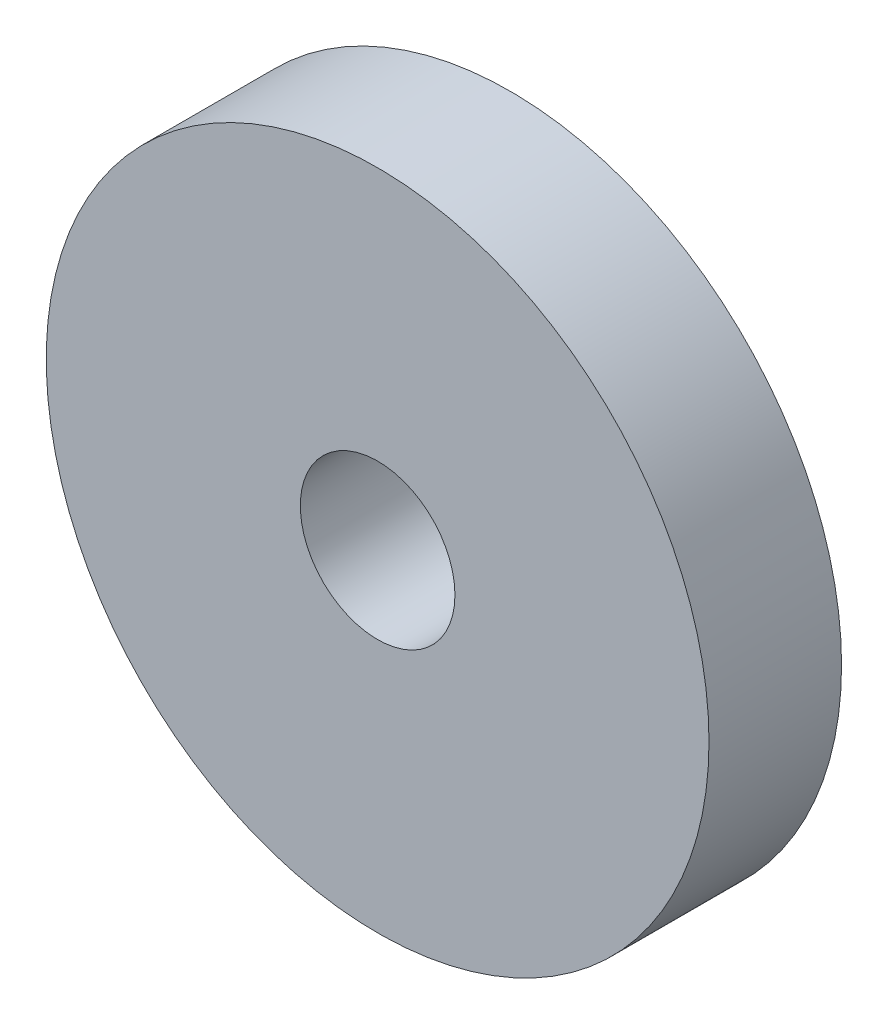
ISO-10303-21;
HEADER;
FILE_DESCRIPTION(('STEP AP214'),'2;1');
FILE_NAME('part.step','',(''),(''),'','','');
FILE_SCHEMA(('AUTOMOTIVE_DESIGN { 1 0 10303 214 1 1 1 1 }'));
ENDSEC;
DATA;
#1=APPLICATION_CONTEXT('core data for automotive mechanical design processes');
#2=APPLICATION_PROTOCOL_DEFINITION('international standard','automotive_design',2000,#1);
#3=PRODUCT_CONTEXT('',#1,'mechanical');
#4=PRODUCT('Part','Part','',(#3));
#5=PRODUCT_RELATED_PRODUCT_CATEGORY('part','',(#4));
#6=PRODUCT_DEFINITION_FORMATION('','',#4);
#7=PRODUCT_DEFINITION_CONTEXT('part definition',#1,'design');
#8=PRODUCT_DEFINITION('design','',#6,#7);
#9=PRODUCT_DEFINITION_SHAPE('','',#8);
#10=(LENGTH_UNIT() NAMED_UNIT(*) SI_UNIT(.MILLI.,.METRE.));
#11=(NAMED_UNIT(*) PLANE_ANGLE_UNIT() SI_UNIT($,.RADIAN.));
#12=(NAMED_UNIT(*) SI_UNIT($,.STERADIAN.) SOLID_ANGLE_UNIT());
#13=UNCERTAINTY_MEASURE_WITH_UNIT(LENGTH_MEASURE(1.E-05),#10,'distance_accuracy_value','');
#14=(GEOMETRIC_REPRESENTATION_CONTEXT(3) GLOBAL_UNCERTAINTY_ASSIGNED_CONTEXT((#13)) GLOBAL_UNIT_ASSIGNED_CONTEXT((#10,
#11,#12)) REPRESENTATION_CONTEXT('',''));
#15=CARTESIAN_POINT('',(0.,0.,0.));
#16=DIRECTION('',(0.,0.,1.));
#17=DIRECTION('',(1.,0.,0.));
#18=AXIS2_PLACEMENT_3D('',#15,#16,#17);
#19=CARTESIAN_POINT('',(-39.8762558406814,-2.62044552723495E-09,3.));
#20=DIRECTION('',(0.,0.,1.));
#21=DIRECTION('',(1.,0.,0.));
#22=AXIS2_PLACEMENT_3D('',#19,#20,#21);
#23=PLANE('',#22);
#24=CARTESIAN_POINT('',(-39.8762558406814,-2.62044552723495E-09,3.));
#25=DIRECTION('',(0.,0.,1.));
#26=DIRECTION('',(1.,0.,0.));
#27=AXIS2_PLACEMENT_3D('',#24,#25,#26);
#28=CIRCLE('',#27,7.5);
#29=CARTESIAN_POINT('',(-32.3762558406814,-2.62044552723495E-09,3.));
#30=VERTEX_POINT('',#29);
#31=EDGE_CURVE('E10',#30,#30,#28,.T.);
#32=ORIENTED_EDGE('',*,*,#31,.T.);
#33=EDGE_LOOP('',(#32));
#34=FACE_BOUND('',#33,.T.);
#35=CARTESIAN_POINT('',(-39.8762558406814,-2.62044552723495E-09,3.));
#36=DIRECTION('',(0.,0.,1.));
#37=DIRECTION('',(1.,0.,0.));
#38=AXIS2_PLACEMENT_3D('',#35,#36,#37);
#39=CIRCLE('',#38,1.75);
#40=CARTESIAN_POINT('',(-38.1262558406814,-2.62044552723495E-09,3.));
#41=VERTEX_POINT('',#40);
#42=EDGE_CURVE('E57',#41,#41,#39,.T.);
#43=ORIENTED_EDGE('',*,*,#42,.F.);
#44=EDGE_LOOP('',(#43));
#45=FACE_BOUND('',#44,.T.);
#46=ADVANCED_FACE('F43',(#34,#45),#23,.T.);
#47=CARTESIAN_POINT('',(-39.8762558406814,-2.62044552723495E-09,0.));
#48=DIRECTION('',(0.,0.,1.));
#49=DIRECTION('',(1.,0.,0.));
#50=AXIS2_PLACEMENT_3D('',#47,#48,#49);
#51=PLANE('',#50);
#52=CARTESIAN_POINT('',(-39.8762558406814,-2.62044552723495E-09,0.));
#53=DIRECTION('',(0.,0.,1.));
#54=DIRECTION('',(1.,0.,0.));
#55=AXIS2_PLACEMENT_3D('',#52,#53,#54);
#56=CIRCLE('',#55,7.5);
#57=CARTESIAN_POINT('',(-32.3762558406814,-2.62044552723495E-09,0.));
#58=VERTEX_POINT('',#57);
#59=EDGE_CURVE('E50',#58,#58,#56,.T.);
#60=ORIENTED_EDGE('',*,*,#59,.F.);
#61=EDGE_LOOP('',(#60));
#62=FACE_BOUND('',#61,.T.);
#63=CARTESIAN_POINT('',(-39.8762558406814,-2.62044552723495E-09,0.));
#64=DIRECTION('',(0.,0.,1.));
#65=DIRECTION('',(1.,0.,0.));
#66=AXIS2_PLACEMENT_3D('',#63,#64,#65);
#67=CIRCLE('',#66,1.75);
#68=CARTESIAN_POINT('',(-38.1262558406814,-2.62044552723495E-09,0.));
#69=VERTEX_POINT('',#68);
#70=EDGE_CURVE('E59',#69,#69,#67,.T.);
#71=ORIENTED_EDGE('',*,*,#70,.T.);
#72=EDGE_LOOP('',(#71));
#73=FACE_BOUND('',#72,.T.);
#74=ADVANCED_FACE('F68',(#62,#73),#51,.F.);
#75=CARTESIAN_POINT('',(-39.8762558406814,-2.62044552723495E-09,3.));
#76=DIRECTION('',(0.,0.,-1.));
#77=DIRECTION('',(-1.,0.,0.));
#78=AXIS2_PLACEMENT_3D('',#75,#76,#77);
#79=CYLINDRICAL_SURFACE('',#78,7.5);
#80=ORIENTED_EDGE('',*,*,#31,.F.);
#81=EDGE_LOOP('',(#80));
#82=FACE_BOUND('',#81,.T.);
#83=ORIENTED_EDGE('',*,*,#59,.T.);
#84=EDGE_LOOP('',(#83));
#85=FACE_BOUND('',#84,.T.);
#86=ADVANCED_FACE('F44',(#82,#85),#79,.T.);
#87=CARTESIAN_POINT('',(-39.8762558406814,-2.62044552723495E-09,3.));
#88=DIRECTION('',(0.,0.,-1.));
#89=DIRECTION('',(-1.,0.,0.));
#90=AXIS2_PLACEMENT_3D('',#87,#88,#89);
#91=CYLINDRICAL_SURFACE('',#90,1.75);
#92=ORIENTED_EDGE('',*,*,#42,.T.);
#93=EDGE_LOOP('',(#92));
#94=FACE_BOUND('',#93,.T.);
#95=ORIENTED_EDGE('',*,*,#70,.F.);
#96=EDGE_LOOP('',(#95));
#97=FACE_BOUND('',#96,.T.);
#98=ADVANCED_FACE('F67',(#94,#97),#91,.F.);
#99=CLOSED_SHELL('',(#46,#74,#86,#98));
#100=MANIFOLD_SOLID_BREP('B2',#99);
#101=ADVANCED_BREP_SHAPE_REPRESENTATION('',(#18,#100),#14);
#102=SHAPE_DEFINITION_REPRESENTATION(#9,#101);
ENDSEC;
END-ISO-10303-21;
